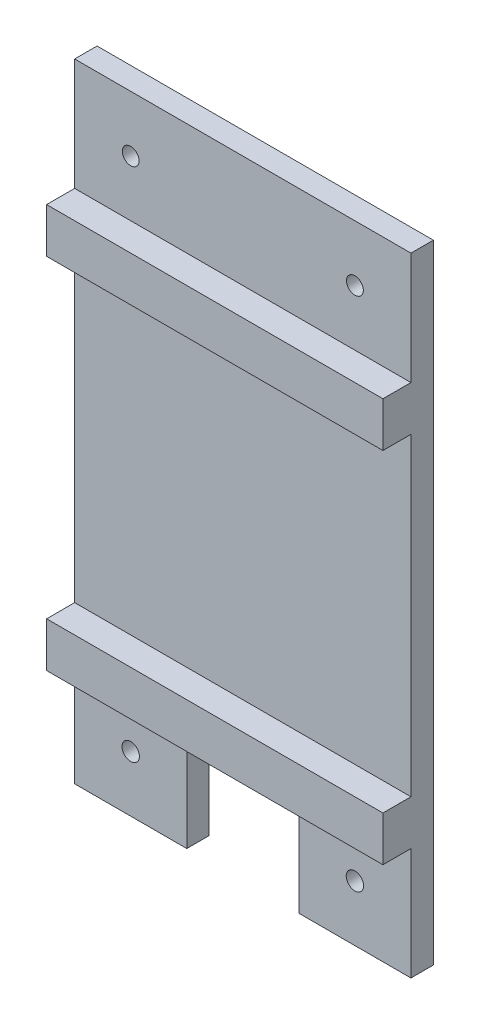
ISO-10303-21;
HEADER;
FILE_DESCRIPTION(('STEP AP214'),'2;1');
FILE_NAME('part.step','',(''),(''),'','','');
FILE_SCHEMA(('AUTOMOTIVE_DESIGN { 1 0 10303 214 1 1 1 1 }'));
ENDSEC;
DATA;
#1=APPLICATION_CONTEXT('core data for automotive mechanical design processes');
#2=APPLICATION_PROTOCOL_DEFINITION('international standard','automotive_design',2000,#1);
#3=PRODUCT_CONTEXT('',#1,'mechanical');
#4=PRODUCT('Part','Part','',(#3));
#5=PRODUCT_RELATED_PRODUCT_CATEGORY('part','',(#4));
#6=PRODUCT_DEFINITION_FORMATION('','',#4);
#7=PRODUCT_DEFINITION_CONTEXT('part definition',#1,'design');
#8=PRODUCT_DEFINITION('design','',#6,#7);
#9=PRODUCT_DEFINITION_SHAPE('','',#8);
#10=(LENGTH_UNIT() NAMED_UNIT(*) SI_UNIT(.MILLI.,.METRE.));
#11=(NAMED_UNIT(*) PLANE_ANGLE_UNIT() SI_UNIT($,.RADIAN.));
#12=(NAMED_UNIT(*) SI_UNIT($,.STERADIAN.) SOLID_ANGLE_UNIT());
#13=UNCERTAINTY_MEASURE_WITH_UNIT(LENGTH_MEASURE(1.E-05),#10,'distance_accuracy_value','');
#14=(GEOMETRIC_REPRESENTATION_CONTEXT(3) GLOBAL_UNCERTAINTY_ASSIGNED_CONTEXT((#13)) GLOBAL_UNIT_ASSIGNED_CONTEXT((#10,
#11,#12)) REPRESENTATION_CONTEXT('',''));
#15=CARTESIAN_POINT('',(0.,0.,0.));
#16=DIRECTION('',(0.,0.,1.));
#17=DIRECTION('',(1.,0.,0.));
#18=AXIS2_PLACEMENT_3D('',#15,#16,#17);
#19=CARTESIAN_POINT('',(0.,0.,4.));
#20=DIRECTION('',(0.,0.,1.));
#21=DIRECTION('',(1.,0.,0.));
#22=AXIS2_PLACEMENT_3D('',#19,#20,#21);
#23=PLANE('',#22);
#24=DIRECTION('',(0.,1.,0.));
#25=VECTOR('',#24,1.);
#26=CARTESIAN_POINT('',(-30.,0.,4.));
#27=LINE('',#26,#25);
#28=CARTESIAN_POINT('',(-30.,-28.,4.));
#29=VERTEX_POINT('',#28);
#30=CARTESIAN_POINT('',(-30.,28.,4.));
#31=VERTEX_POINT('',#30);
#32=EDGE_CURVE('E224',#29,#31,#27,.T.);
#33=ORIENTED_EDGE('',*,*,#32,.F.);
#34=DIRECTION('',(-1.,0.,0.));
#35=VECTOR('',#34,1.);
#36=CARTESIAN_POINT('',(30.,-28.,4.));
#37=LINE('',#36,#35);
#38=CARTESIAN_POINT('',(30.,-28.,4.));
#39=VERTEX_POINT('',#38);
#40=EDGE_CURVE('E50',#39,#29,#37,.T.);
#41=ORIENTED_EDGE('',*,*,#40,.F.);
#42=DIRECTION('',(0.,1.,0.));
#43=VECTOR('',#42,1.);
#44=CARTESIAN_POINT('',(30.,0.,4.));
#45=LINE('',#44,#43);
#46=CARTESIAN_POINT('',(30.,28.,4.));
#47=VERTEX_POINT('',#46);
#48=EDGE_CURVE('E216',#39,#47,#45,.T.);
#49=ORIENTED_EDGE('',*,*,#48,.T.);
#50=DIRECTION('',(-1.,0.,0.));
#51=VECTOR('',#50,1.);
#52=CARTESIAN_POINT('',(0.,28.,4.));
#53=LINE('',#52,#51);
#54=EDGE_CURVE('E184',#47,#31,#53,.T.);
#55=ORIENTED_EDGE('',*,*,#54,.T.);
#56=EDGE_LOOP('',(#33,#41,#49,#55));
#57=FACE_BOUND('',#56,.T.);
#58=ADVANCED_FACE('F35',(#57),#23,.T.);
#59=CARTESIAN_POINT('',(20.,-46.,4.));
#60=DIRECTION('',(0.,0.,1.));
#61=DIRECTION('',(1.,0.,0.));
#62=AXIS2_PLACEMENT_3D('',#59,#60,#61);
#63=CIRCLE('',#62,1.55);
#64=CARTESIAN_POINT('',(21.55,-46.,4.));
#65=VERTEX_POINT('',#64);
#66=EDGE_CURVE('E344',#65,#65,#63,.T.);
#67=ORIENTED_EDGE('',*,*,#66,.F.);
#68=EDGE_LOOP('',(#67));
#69=FACE_BOUND('',#68,.T.);
#70=CARTESIAN_POINT('',(30.,-56.,4.));
#71=VERTEX_POINT('',#70);
#72=CARTESIAN_POINT('',(30.,-36.,4.));
#73=VERTEX_POINT('',#72);
#74=EDGE_CURVE('E58',#71,#73,#45,.T.);
#75=ORIENTED_EDGE('',*,*,#74,.T.);
#76=DIRECTION('',(1.,0.,0.));
#77=VECTOR('',#76,1.);
#78=CARTESIAN_POINT('',(-30.,-36.,4.));
#79=LINE('',#78,#77);
#80=CARTESIAN_POINT('',(10.,-36.,4.));
#81=VERTEX_POINT('',#80);
#82=EDGE_CURVE('E165',#81,#73,#79,.T.);
#83=ORIENTED_EDGE('',*,*,#82,.F.);
#84=DIRECTION('',(0.,-1.,0.));
#85=VECTOR('',#84,1.);
#86=CARTESIAN_POINT('',(10.,0.,4.));
#87=LINE('',#86,#85);
#88=CARTESIAN_POINT('',(10.,-56.,4.));
#89=VERTEX_POINT('',#88);
#90=EDGE_CURVE('E207',#81,#89,#87,.T.);
#91=ORIENTED_EDGE('',*,*,#90,.T.);
#92=DIRECTION('',(1.,0.,0.));
#93=VECTOR('',#92,1.);
#94=CARTESIAN_POINT('',(0.,-56.,4.));
#95=LINE('',#94,#93);
#96=EDGE_CURVE('E210',#89,#71,#95,.T.);
#97=ORIENTED_EDGE('',*,*,#96,.T.);
#98=EDGE_LOOP('',(#75,#83,#91,#97));
#99=FACE_BOUND('',#98,.T.);
#100=ADVANCED_FACE('F309',(#69,#99),#23,.T.);
#101=CARTESIAN_POINT('',(-20.,-46.,4.));
#102=DIRECTION('',(0.,0.,1.));
#103=DIRECTION('',(1.,0.,0.));
#104=AXIS2_PLACEMENT_3D('',#101,#102,#103);
#105=CIRCLE('',#104,1.55);
#106=CARTESIAN_POINT('',(-18.45,-46.,4.));
#107=VERTEX_POINT('',#106);
#108=EDGE_CURVE('E343',#107,#107,#105,.T.);
#109=ORIENTED_EDGE('',*,*,#108,.F.);
#110=EDGE_LOOP('',(#109));
#111=FACE_BOUND('',#110,.T.);
#112=DIRECTION('',(0.,1.,0.));
#113=VECTOR('',#112,1.);
#114=CARTESIAN_POINT('',(-10.,0.,4.));
#115=LINE('',#114,#113);
#116=CARTESIAN_POINT('',(-10.,-56.,4.));
#117=VERTEX_POINT('',#116);
#118=CARTESIAN_POINT('',(-10.,-36.,4.));
#119=VERTEX_POINT('',#118);
#120=EDGE_CURVE('E226',#117,#119,#115,.T.);
#121=ORIENTED_EDGE('',*,*,#120,.T.);
#122=CARTESIAN_POINT('',(-30.,-36.,4.));
#123=VERTEX_POINT('',#122);
#124=EDGE_CURVE('E175',#123,#119,#79,.T.);
#125=ORIENTED_EDGE('',*,*,#124,.F.);
#126=CARTESIAN_POINT('',(-30.,-56.,4.));
#127=VERTEX_POINT('',#126);
#128=EDGE_CURVE('E220',#127,#123,#27,.T.);
#129=ORIENTED_EDGE('',*,*,#128,.F.);
#130=DIRECTION('',(1.,0.,0.));
#131=VECTOR('',#130,1.);
#132=CARTESIAN_POINT('',(0.,-56.,4.));
#133=LINE('',#132,#131);
#134=EDGE_CURVE('E223',#127,#117,#133,.T.);
#135=ORIENTED_EDGE('',*,*,#134,.T.);
#136=EDGE_LOOP('',(#121,#125,#129,#135));
#137=FACE_BOUND('',#136,.T.);
#138=ADVANCED_FACE('F314',(#111,#137),#23,.T.);
#139=CARTESIAN_POINT('',(-20.,46.,4.));
#140=DIRECTION('',(0.,0.,1.));
#141=DIRECTION('',(1.,0.,0.));
#142=AXIS2_PLACEMENT_3D('',#139,#140,#141);
#143=CIRCLE('',#142,1.5);
#144=CARTESIAN_POINT('',(-18.5,46.,4.));
#145=VERTEX_POINT('',#144);
#146=EDGE_CURVE('E330',#145,#145,#143,.T.);
#147=ORIENTED_EDGE('',*,*,#146,.F.);
#148=EDGE_LOOP('',(#147));
#149=FACE_BOUND('',#148,.T.);
#150=CARTESIAN_POINT('',(20.,46.,4.));
#151=DIRECTION('',(0.,0.,1.));
#152=DIRECTION('',(1.,0.,0.));
#153=AXIS2_PLACEMENT_3D('',#150,#151,#152);
#154=CIRCLE('',#153,1.5);
#155=CARTESIAN_POINT('',(21.5,46.,4.));
#156=VERTEX_POINT('',#155);
#157=EDGE_CURVE('E333',#156,#156,#154,.T.);
#158=ORIENTED_EDGE('',*,*,#157,.F.);
#159=EDGE_LOOP('',(#158));
#160=FACE_BOUND('',#159,.T.);
#161=CARTESIAN_POINT('',(-30.,36.,4.));
#162=VERTEX_POINT('',#161);
#163=CARTESIAN_POINT('',(-30.,56.,4.));
#164=VERTEX_POINT('',#163);
#165=EDGE_CURVE('E219',#162,#164,#27,.T.);
#166=ORIENTED_EDGE('',*,*,#165,.F.);
#167=DIRECTION('',(1.,0.,0.));
#168=VECTOR('',#167,1.);
#169=CARTESIAN_POINT('',(0.,36.,4.));
#170=LINE('',#169,#168);
#171=CARTESIAN_POINT('',(30.,36.,4.));
#172=VERTEX_POINT('',#171);
#173=EDGE_CURVE('E192',#162,#172,#170,.T.);
#174=ORIENTED_EDGE('',*,*,#173,.T.);
#175=CARTESIAN_POINT('',(30.,56.,4.));
#176=VERTEX_POINT('',#175);
#177=EDGE_CURVE('E213',#172,#176,#45,.T.);
#178=ORIENTED_EDGE('',*,*,#177,.T.);
#179=DIRECTION('',(1.,0.,0.));
#180=VECTOR('',#179,1.);
#181=CARTESIAN_POINT('',(0.,56.,4.));
#182=LINE('',#181,#180);
#183=EDGE_CURVE('E215',#164,#176,#182,.T.);
#184=ORIENTED_EDGE('',*,*,#183,.F.);
#185=EDGE_LOOP('',(#166,#174,#178,#184));
#186=FACE_BOUND('',#185,.T.);
#187=ADVANCED_FACE('F292',(#149,#160,#186),#23,.T.);
#188=CARTESIAN_POINT('',(10.,0.,4.));
#189=DIRECTION('',(1.,0.,0.));
#190=DIRECTION('',(0.,1.,0.));
#191=AXIS2_PLACEMENT_3D('',#188,#189,#190);
#192=PLANE('',#191);
#193=DIRECTION('',(0.,-1.,0.));
#194=VECTOR('',#193,1.);
#195=CARTESIAN_POINT('',(10.,0.,0.));
#196=LINE('',#195,#194);
#197=CARTESIAN_POINT('',(10.,-36.,0.));
#198=VERTEX_POINT('',#197);
#199=CARTESIAN_POINT('',(10.,-56.,0.));
#200=VERTEX_POINT('',#199);
#201=EDGE_CURVE('E206',#198,#200,#196,.T.);
#202=ORIENTED_EDGE('',*,*,#201,.T.);
#203=DIRECTION('',(0.,0.,-1.));
#204=VECTOR('',#203,1.);
#205=CARTESIAN_POINT('',(10.,-56.,4.));
#206=LINE('',#205,#204);
#207=EDGE_CURVE('E11',#89,#200,#206,.T.);
#208=ORIENTED_EDGE('',*,*,#207,.F.);
#209=ORIENTED_EDGE('',*,*,#90,.F.);
#210=DIRECTION('',(0.,0.,-1.));
#211=VECTOR('',#210,1.);
#212=CARTESIAN_POINT('',(10.,-36.,4.));
#213=LINE('',#212,#211);
#214=EDGE_CURVE('E228',#81,#198,#213,.T.);
#215=ORIENTED_EDGE('',*,*,#214,.T.);
#216=EDGE_LOOP('',(#202,#208,#209,#215));
#217=FACE_BOUND('',#216,.T.);
#218=ADVANCED_FACE('F37',(#217),#192,.F.);
#219=CARTESIAN_POINT('',(0.,-56.,4.));
#220=DIRECTION('',(0.,1.,0.));
#221=DIRECTION('',(-1.,0.,0.));
#222=AXIS2_PLACEMENT_3D('',#219,#220,#221);
#223=PLANE('',#222);
#224=DIRECTION('',(1.,0.,0.));
#225=VECTOR('',#224,1.);
#226=CARTESIAN_POINT('',(0.,-56.,0.));
#227=LINE('',#226,#225);
#228=CARTESIAN_POINT('',(30.,-56.,0.));
#229=VERTEX_POINT('',#228);
#230=EDGE_CURVE('E231',#200,#229,#227,.T.);
#231=ORIENTED_EDGE('',*,*,#230,.T.);
#232=DIRECTION('',(0.,0.,-1.));
#233=VECTOR('',#232,1.);
#234=CARTESIAN_POINT('',(30.,-56.,4.));
#235=LINE('',#234,#233);
#236=EDGE_CURVE('E43',#71,#229,#235,.T.);
#237=ORIENTED_EDGE('',*,*,#236,.F.);
#238=ORIENTED_EDGE('',*,*,#96,.F.);
#239=ORIENTED_EDGE('',*,*,#207,.T.);
#240=EDGE_LOOP('',(#231,#237,#238,#239));
#241=FACE_BOUND('',#240,.T.);
#242=ADVANCED_FACE('F324',(#241),#223,.F.);
#243=CARTESIAN_POINT('',(30.,0.,4.));
#244=DIRECTION('',(-1.,0.,0.));
#245=DIRECTION('',(0.,0.,1.));
#246=AXIS2_PLACEMENT_3D('',#243,#244,#245);
#247=PLANE('',#246);
#248=DIRECTION('',(0.,1.,0.));
#249=VECTOR('',#248,1.);
#250=CARTESIAN_POINT('',(30.,0.,0.));
#251=LINE('',#250,#249);
#252=CARTESIAN_POINT('',(30.,56.,0.));
#253=VERTEX_POINT('',#252);
#254=EDGE_CURVE('E233',#229,#253,#251,.T.);
#255=ORIENTED_EDGE('',*,*,#254,.T.);
#256=DIRECTION('',(0.,0.,-1.));
#257=VECTOR('',#256,1.);
#258=CARTESIAN_POINT('',(30.,56.,4.));
#259=LINE('',#258,#257);
#260=EDGE_CURVE('E258',#176,#253,#259,.T.);
#261=ORIENTED_EDGE('',*,*,#260,.F.);
#262=ORIENTED_EDGE('',*,*,#177,.F.);
#263=DIRECTION('',(0.,0.,-1.));
#264=VECTOR('',#263,1.);
#265=CARTESIAN_POINT('',(30.,36.,9.));
#266=LINE('',#265,#264);
#267=CARTESIAN_POINT('',(30.,36.,9.));
#268=VERTEX_POINT('',#267);
#269=EDGE_CURVE('E191',#268,#172,#266,.T.);
#270=ORIENTED_EDGE('',*,*,#269,.F.);
#271=DIRECTION('',(0.,1.,0.));
#272=VECTOR('',#271,1.);
#273=CARTESIAN_POINT('',(30.,0.,9.));
#274=LINE('',#273,#272);
#275=CARTESIAN_POINT('',(30.,28.,9.));
#276=VERTEX_POINT('',#275);
#277=EDGE_CURVE('E189',#276,#268,#274,.T.);
#278=ORIENTED_EDGE('',*,*,#277,.F.);
#279=DIRECTION('',(0.,0.,-1.));
#280=VECTOR('',#279,1.);
#281=CARTESIAN_POINT('',(30.,28.,9.));
#282=LINE('',#281,#280);
#283=EDGE_CURVE('E198',#276,#47,#282,.T.);
#284=ORIENTED_EDGE('',*,*,#283,.T.);
#285=ORIENTED_EDGE('',*,*,#48,.F.);
#286=DIRECTION('',(0.,0.,-1.));
#287=VECTOR('',#286,1.);
#288=CARTESIAN_POINT('',(30.,-28.,9.));
#289=LINE('',#288,#287);
#290=CARTESIAN_POINT('',(30.,-28.,9.));
#291=VERTEX_POINT('',#290);
#292=EDGE_CURVE('E172',#291,#39,#289,.T.);
#293=ORIENTED_EDGE('',*,*,#292,.F.);
#294=DIRECTION('',(0.,1.,0.));
#295=VECTOR('',#294,1.);
#296=CARTESIAN_POINT('',(30.,-36.,9.));
#297=LINE('',#296,#295);
#298=CARTESIAN_POINT('',(30.,-36.,9.));
#299=VERTEX_POINT('',#298);
#300=EDGE_CURVE('E153',#299,#291,#297,.T.);
#301=ORIENTED_EDGE('',*,*,#300,.F.);
#302=DIRECTION('',(0.,0.,-1.));
#303=VECTOR('',#302,1.);
#304=CARTESIAN_POINT('',(30.,-36.,9.));
#305=LINE('',#304,#303);
#306=EDGE_CURVE('E160',#299,#73,#305,.T.);
#307=ORIENTED_EDGE('',*,*,#306,.T.);
#308=ORIENTED_EDGE('',*,*,#74,.F.);
#309=ORIENTED_EDGE('',*,*,#236,.T.);
#310=EDGE_LOOP('',(#255,#261,#262,#270,#278,#284,#285,#293,#301,#307,#308,#309));
#311=FACE_BOUND('',#310,.T.);
#312=ADVANCED_FACE('F170',(#311),#247,.F.);
#313=CARTESIAN_POINT('',(0.,56.,4.));
#314=DIRECTION('',(0.,1.,0.));
#315=DIRECTION('',(0.,0.,1.));
#316=AXIS2_PLACEMENT_3D('',#313,#314,#315);
#317=PLANE('',#316);
#318=DIRECTION('',(1.,0.,0.));
#319=VECTOR('',#318,1.);
#320=CARTESIAN_POINT('',(0.,56.,0.));
#321=LINE('',#320,#319);
#322=CARTESIAN_POINT('',(-30.,56.,0.));
#323=VERTEX_POINT('',#322);
#324=EDGE_CURVE('E235',#323,#253,#321,.T.);
#325=ORIENTED_EDGE('',*,*,#324,.F.);
#326=DIRECTION('',(0.,0.,-1.));
#327=VECTOR('',#326,1.);
#328=CARTESIAN_POINT('',(-30.,56.,4.));
#329=LINE('',#328,#327);
#330=EDGE_CURVE('E256',#164,#323,#329,.T.);
#331=ORIENTED_EDGE('',*,*,#330,.F.);
#332=ORIENTED_EDGE('',*,*,#183,.T.);
#333=ORIENTED_EDGE('',*,*,#260,.T.);
#334=EDGE_LOOP('',(#325,#331,#332,#333));
#335=FACE_BOUND('',#334,.T.);
#336=ADVANCED_FACE('F272',(#335),#317,.T.);
#337=CARTESIAN_POINT('',(-30.,0.,4.));
#338=DIRECTION('',(-1.,0.,0.));
#339=DIRECTION('',(0.,0.,1.));
#340=AXIS2_PLACEMENT_3D('',#337,#338,#339);
#341=PLANE('',#340);
#342=DIRECTION('',(0.,1.,0.));
#343=VECTOR('',#342,1.);
#344=CARTESIAN_POINT('',(-30.,0.,0.));
#345=LINE('',#344,#343);
#346=CARTESIAN_POINT('',(-30.,-56.,0.));
#347=VERTEX_POINT('',#346);
#348=EDGE_CURVE('E238',#347,#323,#345,.T.);
#349=ORIENTED_EDGE('',*,*,#348,.F.);
#350=DIRECTION('',(0.,0.,-1.));
#351=VECTOR('',#350,1.);
#352=CARTESIAN_POINT('',(-30.,-56.,4.));
#353=LINE('',#352,#351);
#354=EDGE_CURVE('E254',#127,#347,#353,.T.);
#355=ORIENTED_EDGE('',*,*,#354,.F.);
#356=ORIENTED_EDGE('',*,*,#128,.T.);
#357=DIRECTION('',(0.,0.,-1.));
#358=VECTOR('',#357,1.);
#359=CARTESIAN_POINT('',(-30.,-36.,9.));
#360=LINE('',#359,#358);
#361=CARTESIAN_POINT('',(-30.,-36.,9.));
#362=VERTEX_POINT('',#361);
#363=EDGE_CURVE('E167',#362,#123,#360,.T.);
#364=ORIENTED_EDGE('',*,*,#363,.F.);
#365=DIRECTION('',(0.,-1.,0.));
#366=VECTOR('',#365,1.);
#367=CARTESIAN_POINT('',(-30.,-28.,9.));
#368=LINE('',#367,#366);
#369=CARTESIAN_POINT('',(-30.,-28.,9.));
#370=VERTEX_POINT('',#369);
#371=EDGE_CURVE('E156',#370,#362,#368,.T.);
#372=ORIENTED_EDGE('',*,*,#371,.F.);
#373=DIRECTION('',(0.,0.,-1.));
#374=VECTOR('',#373,1.);
#375=CARTESIAN_POINT('',(-30.,-28.,9.));
#376=LINE('',#375,#374);
#377=EDGE_CURVE('E289',#370,#29,#376,.T.);
#378=ORIENTED_EDGE('',*,*,#377,.T.);
#379=ORIENTED_EDGE('',*,*,#32,.T.);
#380=DIRECTION('',(0.,0.,-1.));
#381=VECTOR('',#380,1.);
#382=CARTESIAN_POINT('',(-30.,28.,9.));
#383=LINE('',#382,#381);
#384=CARTESIAN_POINT('',(-30.,28.,9.));
#385=VERTEX_POINT('',#384);
#386=EDGE_CURVE('E201',#385,#31,#383,.T.);
#387=ORIENTED_EDGE('',*,*,#386,.F.);
#388=DIRECTION('',(0.,-1.,0.));
#389=VECTOR('',#388,1.);
#390=CARTESIAN_POINT('',(-30.,0.,9.));
#391=LINE('',#390,#389);
#392=CARTESIAN_POINT('',(-30.,36.,9.));
#393=VERTEX_POINT('',#392);
#394=EDGE_CURVE('E183',#393,#385,#391,.T.);
#395=ORIENTED_EDGE('',*,*,#394,.F.);
#396=DIRECTION('',(0.,0.,-1.));
#397=VECTOR('',#396,1.);
#398=CARTESIAN_POINT('',(-30.,36.,9.));
#399=LINE('',#398,#397);
#400=EDGE_CURVE('E204',#393,#162,#399,.T.);
#401=ORIENTED_EDGE('',*,*,#400,.T.);
#402=ORIENTED_EDGE('',*,*,#165,.T.);
#403=ORIENTED_EDGE('',*,*,#330,.T.);
#404=EDGE_LOOP('',(#349,#355,#356,#364,#372,#378,#379,#387,#395,#401,#402,#403));
#405=FACE_BOUND('',#404,.T.);
#406=ADVANCED_FACE('F285',(#405),#341,.T.);
#407=CARTESIAN_POINT('',(0.,-56.,4.));
#408=DIRECTION('',(0.,1.,0.));
#409=DIRECTION('',(0.,0.,1.));
#410=AXIS2_PLACEMENT_3D('',#407,#408,#409);
#411=PLANE('',#410);
#412=DIRECTION('',(1.,0.,0.));
#413=VECTOR('',#412,1.);
#414=CARTESIAN_POINT('',(0.,-56.,0.));
#415=LINE('',#414,#413);
#416=CARTESIAN_POINT('',(-10.,-56.,0.));
#417=VERTEX_POINT('',#416);
#418=EDGE_CURVE('E241',#347,#417,#415,.T.);
#419=ORIENTED_EDGE('',*,*,#418,.T.);
#420=DIRECTION('',(0.,0.,-1.));
#421=VECTOR('',#420,1.);
#422=CARTESIAN_POINT('',(-10.,-56.,4.));
#423=LINE('',#422,#421);
#424=EDGE_CURVE('E251',#117,#417,#423,.T.);
#425=ORIENTED_EDGE('',*,*,#424,.F.);
#426=ORIENTED_EDGE('',*,*,#134,.F.);
#427=ORIENTED_EDGE('',*,*,#354,.T.);
#428=EDGE_LOOP('',(#419,#425,#426,#427));
#429=FACE_BOUND('',#428,.T.);
#430=ADVANCED_FACE('F381',(#429),#411,.F.);
#431=CARTESIAN_POINT('',(-10.,0.,4.));
#432=DIRECTION('',(-1.,0.,0.));
#433=DIRECTION('',(0.,0.,1.));
#434=AXIS2_PLACEMENT_3D('',#431,#432,#433);
#435=PLANE('',#434);
#436=DIRECTION('',(0.,1.,0.));
#437=VECTOR('',#436,1.);
#438=CARTESIAN_POINT('',(-10.,0.,0.));
#439=LINE('',#438,#437);
#440=CARTESIAN_POINT('',(-10.,-36.,0.));
#441=VERTEX_POINT('',#440);
#442=EDGE_CURVE('E243',#417,#441,#439,.T.);
#443=ORIENTED_EDGE('',*,*,#442,.T.);
#444=DIRECTION('',(0.,0.,-1.));
#445=VECTOR('',#444,1.);
#446=CARTESIAN_POINT('',(-10.,-36.,4.));
#447=LINE('',#446,#445);
#448=EDGE_CURVE('E248',#119,#441,#447,.T.);
#449=ORIENTED_EDGE('',*,*,#448,.F.);
#450=ORIENTED_EDGE('',*,*,#120,.F.);
#451=ORIENTED_EDGE('',*,*,#424,.T.);
#452=EDGE_LOOP('',(#443,#449,#450,#451));
#453=FACE_BOUND('',#452,.T.);
#454=ADVANCED_FACE('F368',(#453),#435,.F.);
#455=CARTESIAN_POINT('',(0.,-36.,4.));
#456=DIRECTION('',(0.,1.,0.));
#457=DIRECTION('',(0.,0.,1.));
#458=AXIS2_PLACEMENT_3D('',#455,#456,#457);
#459=PLANE('',#458);
#460=DIRECTION('',(1.,0.,0.));
#461=VECTOR('',#460,1.);
#462=CARTESIAN_POINT('',(0.,-36.,0.));
#463=LINE('',#462,#461);
#464=EDGE_CURVE('E211',#441,#198,#463,.T.);
#465=ORIENTED_EDGE('',*,*,#464,.T.);
#466=ORIENTED_EDGE('',*,*,#214,.F.);
#467=ORIENTED_EDGE('',*,*,#82,.T.);
#468=ORIENTED_EDGE('',*,*,#306,.F.);
#469=DIRECTION('',(1.,0.,0.));
#470=VECTOR('',#469,1.);
#471=CARTESIAN_POINT('',(-30.,-36.,9.));
#472=LINE('',#471,#470);
#473=EDGE_CURVE('E149',#362,#299,#472,.T.);
#474=ORIENTED_EDGE('',*,*,#473,.F.);
#475=ORIENTED_EDGE('',*,*,#363,.T.);
#476=ORIENTED_EDGE('',*,*,#124,.T.);
#477=ORIENTED_EDGE('',*,*,#448,.T.);
#478=EDGE_LOOP('',(#465,#466,#467,#468,#474,#475,#476,#477));
#479=FACE_BOUND('',#478,.T.);
#480=ADVANCED_FACE('F163',(#479),#459,.F.);
#481=CARTESIAN_POINT('',(0.,0.,0.));
#482=DIRECTION('',(0.,0.,1.));
#483=DIRECTION('',(1.,0.,0.));
#484=AXIS2_PLACEMENT_3D('',#481,#482,#483);
#485=PLANE('',#484);
#486=CARTESIAN_POINT('',(20.,-46.,0.));
#487=DIRECTION('',(0.,0.,1.));
#488=DIRECTION('',(1.,0.,0.));
#489=AXIS2_PLACEMENT_3D('',#486,#487,#488);
#490=CIRCLE('',#489,1.55);
#491=CARTESIAN_POINT('',(21.55,-46.,0.));
#492=VERTEX_POINT('',#491);
#493=EDGE_CURVE('E340',#492,#492,#490,.T.);
#494=ORIENTED_EDGE('',*,*,#493,.T.);
#495=EDGE_LOOP('',(#494));
#496=FACE_BOUND('',#495,.T.);
#497=CARTESIAN_POINT('',(-20.,46.,0.));
#498=DIRECTION('',(0.,0.,1.));
#499=DIRECTION('',(1.,0.,0.));
#500=AXIS2_PLACEMENT_3D('',#497,#498,#499);
#501=CIRCLE('',#500,1.5);
#502=CARTESIAN_POINT('',(-18.5,46.,0.));
#503=VERTEX_POINT('',#502);
#504=EDGE_CURVE('E347',#503,#503,#501,.T.);
#505=ORIENTED_EDGE('',*,*,#504,.T.);
#506=EDGE_LOOP('',(#505));
#507=FACE_BOUND('',#506,.T.);
#508=CARTESIAN_POINT('',(20.,46.,0.));
#509=DIRECTION('',(0.,0.,1.));
#510=DIRECTION('',(1.,0.,0.));
#511=AXIS2_PLACEMENT_3D('',#508,#509,#510);
#512=CIRCLE('',#511,1.5);
#513=CARTESIAN_POINT('',(21.5,46.,0.));
#514=VERTEX_POINT('',#513);
#515=EDGE_CURVE('E335',#514,#514,#512,.T.);
#516=ORIENTED_EDGE('',*,*,#515,.T.);
#517=EDGE_LOOP('',(#516));
#518=FACE_BOUND('',#517,.T.);
#519=CARTESIAN_POINT('',(-20.,-46.,0.));
#520=DIRECTION('',(0.,0.,1.));
#521=DIRECTION('',(1.,0.,0.));
#522=AXIS2_PLACEMENT_3D('',#519,#520,#521);
#523=CIRCLE('',#522,1.55);
#524=CARTESIAN_POINT('',(-18.45,-46.,0.));
#525=VERTEX_POINT('',#524);
#526=EDGE_CURVE('E351',#525,#525,#523,.T.);
#527=ORIENTED_EDGE('',*,*,#526,.T.);
#528=EDGE_LOOP('',(#527));
#529=FACE_BOUND('',#528,.T.);
#530=ORIENTED_EDGE('',*,*,#201,.F.);
#531=ORIENTED_EDGE('',*,*,#464,.F.);
#532=ORIENTED_EDGE('',*,*,#442,.F.);
#533=ORIENTED_EDGE('',*,*,#418,.F.);
#534=ORIENTED_EDGE('',*,*,#348,.T.);
#535=ORIENTED_EDGE('',*,*,#324,.T.);
#536=ORIENTED_EDGE('',*,*,#254,.F.);
#537=ORIENTED_EDGE('',*,*,#230,.F.);
#538=EDGE_LOOP('',(#530,#531,#532,#533,#534,#535,#536,#537));
#539=FACE_BOUND('',#538,.T.);
#540=ADVANCED_FACE('F266',(#496,#507,#518,#529,#539),#485,.F.);
#541=CARTESIAN_POINT('',(0.,36.,9.));
#542=DIRECTION('',(0.,1.,0.));
#543=DIRECTION('',(0.,0.,1.));
#544=AXIS2_PLACEMENT_3D('',#541,#542,#543);
#545=PLANE('',#544);
#546=ORIENTED_EDGE('',*,*,#173,.F.);
#547=ORIENTED_EDGE('',*,*,#400,.F.);
#548=DIRECTION('',(1.,0.,0.));
#549=VECTOR('',#548,1.);
#550=CARTESIAN_POINT('',(0.,36.,9.));
#551=LINE('',#550,#549);
#552=EDGE_CURVE('E180',#393,#268,#551,.T.);
#553=ORIENTED_EDGE('',*,*,#552,.T.);
#554=ORIENTED_EDGE('',*,*,#269,.T.);
#555=EDGE_LOOP('',(#546,#547,#553,#554));
#556=FACE_BOUND('',#555,.T.);
#557=ADVANCED_FACE('F294',(#556),#545,.T.);
#558=CARTESIAN_POINT('',(0.,28.,9.));
#559=DIRECTION('',(0.,-1.,0.));
#560=DIRECTION('',(1.,0.,0.));
#561=AXIS2_PLACEMENT_3D('',#558,#559,#560);
#562=PLANE('',#561);
#563=ORIENTED_EDGE('',*,*,#54,.F.);
#564=ORIENTED_EDGE('',*,*,#283,.F.);
#565=DIRECTION('',(-1.,0.,0.));
#566=VECTOR('',#565,1.);
#567=CARTESIAN_POINT('',(0.,28.,9.));
#568=LINE('',#567,#566);
#569=EDGE_CURVE('E186',#276,#385,#568,.T.);
#570=ORIENTED_EDGE('',*,*,#569,.T.);
#571=ORIENTED_EDGE('',*,*,#386,.T.);
#572=EDGE_LOOP('',(#563,#564,#570,#571));
#573=FACE_BOUND('',#572,.T.);
#574=ADVANCED_FACE('F281',(#573),#562,.T.);
#575=CARTESIAN_POINT('',(0.,0.,9.));
#576=DIRECTION('',(0.,0.,1.));
#577=DIRECTION('',(1.,0.,0.));
#578=AXIS2_PLACEMENT_3D('',#575,#576,#577);
#579=PLANE('',#578);
#580=ORIENTED_EDGE('',*,*,#552,.F.);
#581=ORIENTED_EDGE('',*,*,#394,.T.);
#582=ORIENTED_EDGE('',*,*,#569,.F.);
#583=ORIENTED_EDGE('',*,*,#277,.T.);
#584=EDGE_LOOP('',(#580,#581,#582,#583));
#585=FACE_BOUND('',#584,.T.);
#586=ADVANCED_FACE('F296',(#585),#579,.T.);
#587=CARTESIAN_POINT('',(30.,-28.,9.));
#588=DIRECTION('',(0.,-1.,0.));
#589=DIRECTION('',(1.,0.,0.));
#590=AXIS2_PLACEMENT_3D('',#587,#588,#589);
#591=PLANE('',#590);
#592=ORIENTED_EDGE('',*,*,#40,.T.);
#593=ORIENTED_EDGE('',*,*,#377,.F.);
#594=DIRECTION('',(-1.,0.,0.));
#595=VECTOR('',#594,1.);
#596=CARTESIAN_POINT('',(30.,-28.,9.));
#597=LINE('',#596,#595);
#598=EDGE_CURVE('E173',#291,#370,#597,.T.);
#599=ORIENTED_EDGE('',*,*,#598,.F.);
#600=ORIENTED_EDGE('',*,*,#292,.T.);
#601=EDGE_LOOP('',(#592,#593,#599,#600));
#602=FACE_BOUND('',#601,.T.);
#603=ADVANCED_FACE('F298',(#602),#591,.F.);
#604=CARTESIAN_POINT('',(0.,0.,9.));
#605=DIRECTION('',(0.,0.,1.));
#606=DIRECTION('',(1.,0.,0.));
#607=AXIS2_PLACEMENT_3D('',#604,#605,#606);
#608=PLANE('',#607);
#609=ORIENTED_EDGE('',*,*,#300,.T.);
#610=ORIENTED_EDGE('',*,*,#598,.T.);
#611=ORIENTED_EDGE('',*,*,#371,.T.);
#612=ORIENTED_EDGE('',*,*,#473,.T.);
#613=EDGE_LOOP('',(#609,#610,#611,#612));
#614=FACE_BOUND('',#613,.T.);
#615=ADVANCED_FACE('F151',(#614),#608,.T.);
#616=CARTESIAN_POINT('',(-20.,-46.,0.));
#617=DIRECTION('',(0.,0.,1.));
#618=DIRECTION('',(1.,0.,0.));
#619=AXIS2_PLACEMENT_3D('',#616,#617,#618);
#620=CYLINDRICAL_SURFACE('',#619,1.55);
#621=ORIENTED_EDGE('',*,*,#526,.F.);
#622=EDGE_LOOP('',(#621));
#623=FACE_BOUND('',#622,.T.);
#624=ORIENTED_EDGE('',*,*,#108,.T.);
#625=EDGE_LOOP('',(#624));
#626=FACE_BOUND('',#625,.T.);
#627=ADVANCED_FACE('F401',(#623,#626),#620,.F.);
#628=CARTESIAN_POINT('',(20.,46.,0.));
#629=DIRECTION('',(0.,0.,1.));
#630=DIRECTION('',(1.,0.,0.));
#631=AXIS2_PLACEMENT_3D('',#628,#629,#630);
#632=CYLINDRICAL_SURFACE('',#631,1.5);
#633=ORIENTED_EDGE('',*,*,#515,.F.);
#634=EDGE_LOOP('',(#633));
#635=FACE_BOUND('',#634,.T.);
#636=ORIENTED_EDGE('',*,*,#157,.T.);
#637=EDGE_LOOP('',(#636));
#638=FACE_BOUND('',#637,.T.);
#639=ADVANCED_FACE('F404',(#635,#638),#632,.F.);
#640=CARTESIAN_POINT('',(-20.,46.,0.));
#641=DIRECTION('',(0.,0.,1.));
#642=DIRECTION('',(1.,0.,0.));
#643=AXIS2_PLACEMENT_3D('',#640,#641,#642);
#644=CYLINDRICAL_SURFACE('',#643,1.5);
#645=ORIENTED_EDGE('',*,*,#504,.F.);
#646=EDGE_LOOP('',(#645));
#647=FACE_BOUND('',#646,.T.);
#648=ORIENTED_EDGE('',*,*,#146,.T.);
#649=EDGE_LOOP('',(#648));
#650=FACE_BOUND('',#649,.T.);
#651=ADVANCED_FACE('F411',(#647,#650),#644,.F.);
#652=CARTESIAN_POINT('',(20.,-46.,0.));
#653=DIRECTION('',(0.,0.,1.));
#654=DIRECTION('',(1.,0.,0.));
#655=AXIS2_PLACEMENT_3D('',#652,#653,#654);
#656=CYLINDRICAL_SURFACE('',#655,1.55);
#657=ORIENTED_EDGE('',*,*,#493,.F.);
#658=EDGE_LOOP('',(#657));
#659=FACE_BOUND('',#658,.T.);
#660=ORIENTED_EDGE('',*,*,#66,.T.);
#661=EDGE_LOOP('',(#660));
#662=FACE_BOUND('',#661,.T.);
#663=ADVANCED_FACE('F417',(#659,#662),#656,.F.);
#664=CLOSED_SHELL('',(#58,#100,#138,#187,#218,#242,#312,#336,#406,#430,#454,#480,#540,#557,#574,
#586,#603,#615,#627,#639,#651,#663));
#665=MANIFOLD_SOLID_BREP('B2',#664);
#666=ADVANCED_BREP_SHAPE_REPRESENTATION('',(#18,#665),#14);
#667=SHAPE_DEFINITION_REPRESENTATION(#9,#666);
ENDSEC;
END-ISO-10303-21;
